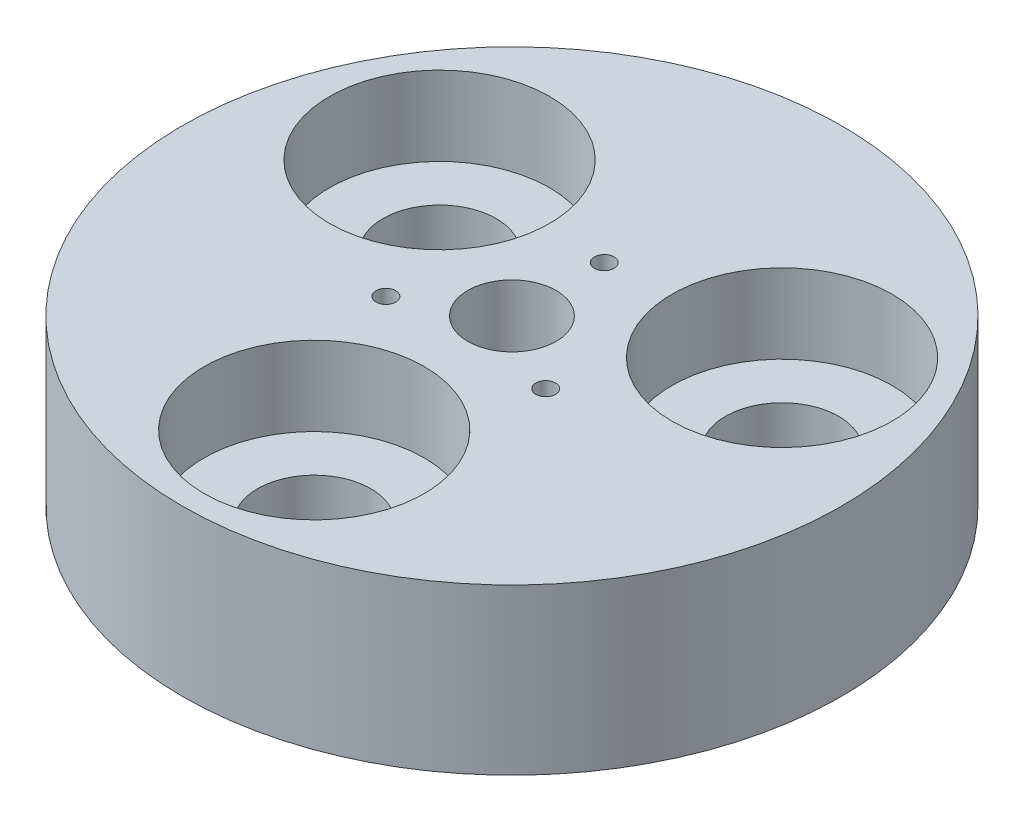
ISO-10303-21;
HEADER;
FILE_DESCRIPTION(('STEP AP214'),'2;1');
FILE_NAME('part.step','',(''),(''),'','','');
FILE_SCHEMA(('AUTOMOTIVE_DESIGN { 1 0 10303 214 1 1 1 1 }'));
ENDSEC;
DATA;
#1=APPLICATION_CONTEXT('core data for automotive mechanical design processes');
#2=APPLICATION_PROTOCOL_DEFINITION('international standard','automotive_design',2000,#1);
#3=PRODUCT_CONTEXT('',#1,'mechanical');
#4=PRODUCT('Part','Part','',(#3));
#5=PRODUCT_RELATED_PRODUCT_CATEGORY('part','',(#4));
#6=PRODUCT_DEFINITION_FORMATION('','',#4);
#7=PRODUCT_DEFINITION_CONTEXT('part definition',#1,'design');
#8=PRODUCT_DEFINITION('design','',#6,#7);
#9=PRODUCT_DEFINITION_SHAPE('','',#8);
#10=(LENGTH_UNIT() NAMED_UNIT(*) SI_UNIT(.MILLI.,.METRE.));
#11=(NAMED_UNIT(*) PLANE_ANGLE_UNIT() SI_UNIT($,.RADIAN.));
#12=(NAMED_UNIT(*) SI_UNIT($,.STERADIAN.) SOLID_ANGLE_UNIT());
#13=UNCERTAINTY_MEASURE_WITH_UNIT(LENGTH_MEASURE(1.E-05),#10,'distance_accuracy_value','');
#14=(GEOMETRIC_REPRESENTATION_CONTEXT(3) GLOBAL_UNCERTAINTY_ASSIGNED_CONTEXT((#13)) GLOBAL_UNIT_ASSIGNED_CONTEXT((#10,
#11,#12)) REPRESENTATION_CONTEXT('',''));
#15=CARTESIAN_POINT('',(0.,0.,0.));
#16=DIRECTION('',(0.,0.,1.));
#17=DIRECTION('',(1.,0.,0.));
#18=AXIS2_PLACEMENT_3D('',#15,#16,#17);
#19=CARTESIAN_POINT('',(0.,3.17500000000001,0.));
#20=DIRECTION('',(0.,-1.,0.));
#21=DIRECTION('',(0.,0.,-1.));
#22=AXIS2_PLACEMENT_3D('',#19,#20,#21);
#23=CYLINDRICAL_SURFACE('',#22,6.35);
#24=CARTESIAN_POINT('',(0.,3.17500000000001,0.));
#25=DIRECTION('',(0.,1.,0.));
#26=DIRECTION('',(0.,0.,1.));
#27=AXIS2_PLACEMENT_3D('',#24,#25,#26);
#28=CIRCLE('',#27,6.35);
#29=CARTESIAN_POINT('',(0.,3.17500000000001,6.35));
#30=VERTEX_POINT('',#29);
#31=EDGE_CURVE('E12',#30,#30,#28,.T.);
#32=ORIENTED_EDGE('',*,*,#31,.F.);
#33=EDGE_LOOP('',(#32));
#34=FACE_BOUND('',#33,.T.);
#35=CARTESIAN_POINT('',(0.,0.,0.));
#36=DIRECTION('',(0.,1.,0.));
#37=DIRECTION('',(0.,0.,1.));
#38=AXIS2_PLACEMENT_3D('',#35,#36,#37);
#39=CIRCLE('',#38,6.35);
#40=CARTESIAN_POINT('',(0.,0.,6.35));
#41=VERTEX_POINT('',#40);
#42=EDGE_CURVE('E48',#41,#41,#39,.T.);
#43=ORIENTED_EDGE('',*,*,#42,.T.);
#44=EDGE_LOOP('',(#43));
#45=FACE_BOUND('',#44,.T.);
#46=ADVANCED_FACE('F45',(#34,#45),#23,.T.);
#47=CARTESIAN_POINT('',(0.,3.17500000000001,0.));
#48=DIRECTION('',(0.,1.,0.));
#49=DIRECTION('',(0.,0.,1.));
#50=AXIS2_PLACEMENT_3D('',#47,#48,#49);
#51=PLANE('',#50);
#52=CARTESIAN_POINT('',(3.29955678841873,3.17500000000001,-1.90499999999997));
#53=DIRECTION('',(0.,1.,0.));
#54=DIRECTION('',(0.,0.,1.));
#55=AXIS2_PLACEMENT_3D('',#52,#53,#54);
#56=CIRCLE('',#55,2.12089999999999);
#57=CARTESIAN_POINT('',(3.29955678841873,3.17500000000001,0.215900000000025));
#58=VERTEX_POINT('',#57);
#59=EDGE_CURVE('E113',#58,#58,#56,.T.);
#60=ORIENTED_EDGE('',*,*,#59,.F.);
#61=EDGE_LOOP('',(#60));
#62=FACE_BOUND('',#61,.T.);
#63=CARTESIAN_POINT('',(-3.2995567884187,3.17500000000001,-1.90500000000002));
#64=DIRECTION('',(0.,1.,0.));
#65=DIRECTION('',(0.,0.,1.));
#66=AXIS2_PLACEMENT_3D('',#63,#64,#65);
#67=CIRCLE('',#66,2.12089999999999);
#68=CARTESIAN_POINT('',(-3.2995567884187,3.17500000000001,0.21589999999998));
#69=VERTEX_POINT('',#68);
#70=EDGE_CURVE('E101',#69,#69,#67,.T.);
#71=ORIENTED_EDGE('',*,*,#70,.F.);
#72=EDGE_LOOP('',(#71));
#73=FACE_BOUND('',#72,.T.);
#74=CARTESIAN_POINT('',(0.,3.17500000000001,3.81));
#75=DIRECTION('',(0.,1.,0.));
#76=DIRECTION('',(0.,0.,1.));
#77=AXIS2_PLACEMENT_3D('',#74,#75,#76);
#78=CIRCLE('',#77,2.12089999999999);
#79=CARTESIAN_POINT('',(0.,3.17500000000001,5.9309));
#80=VERTEX_POINT('',#79);
#81=EDGE_CURVE('E89',#80,#80,#78,.T.);
#82=ORIENTED_EDGE('',*,*,#81,.F.);
#83=EDGE_LOOP('',(#82));
#84=FACE_BOUND('',#83,.T.);
#85=CARTESIAN_POINT('',(0.,3.17500000000001,0.));
#86=DIRECTION('',(0.,1.,0.));
#87=DIRECTION('',(0.,0.,1.));
#88=AXIS2_PLACEMENT_3D('',#85,#86,#87);
#89=CIRCLE('',#88,0.8509);
#90=CARTESIAN_POINT('',(0.,3.17500000000001,0.8509));
#91=VERTEX_POINT('',#90);
#92=EDGE_CURVE('E77',#91,#91,#89,.T.);
#93=ORIENTED_EDGE('',*,*,#92,.F.);
#94=EDGE_LOOP('',(#93));
#95=FACE_BOUND('',#94,.T.);
#96=CARTESIAN_POINT('',(1.53979316792873,3.17500000000001,0.889000000000008));
#97=DIRECTION('',(0.,1.,0.));
#98=DIRECTION('',(-0.866025403784437,0.,-0.500000000000004));
#99=AXIS2_PLACEMENT_3D('',#96,#97,#98);
#100=CIRCLE('',#99,0.1905);
#101=CARTESIAN_POINT('',(1.37481532850779,3.17500000000001,0.793750000000008));
#102=VERTEX_POINT('',#101);
#103=EDGE_CURVE('E70',#102,#102,#100,.T.);
#104=ORIENTED_EDGE('',*,*,#103,.F.);
#105=EDGE_LOOP('',(#104));
#106=FACE_BOUND('',#105,.T.);
#107=CARTESIAN_POINT('',(-1.53979316792874,3.17500000000001,0.888999999999987));
#108=DIRECTION('',(0.,1.,0.));
#109=DIRECTION('',(0.866025403784444,0.,-0.499999999999992));
#110=AXIS2_PLACEMENT_3D('',#107,#108,#109);
#111=CIRCLE('',#110,0.1905);
#112=CARTESIAN_POINT('',(-1.37481532850781,3.17500000000001,0.793749999999988));
#113=VERTEX_POINT('',#112);
#114=EDGE_CURVE('E63',#113,#113,#111,.T.);
#115=ORIENTED_EDGE('',*,*,#114,.F.);
#116=EDGE_LOOP('',(#115));
#117=FACE_BOUND('',#116,.T.);
#118=CARTESIAN_POINT('',(0.,3.17500000000001,-1.778));
#119=DIRECTION('',(0.,1.,0.));
#120=DIRECTION('',(0.,0.,1.));
#121=AXIS2_PLACEMENT_3D('',#118,#119,#120);
#122=CIRCLE('',#121,0.1905);
#123=CARTESIAN_POINT('',(0.,3.17500000000001,-1.5875));
#124=VERTEX_POINT('',#123);
#125=EDGE_CURVE('E57',#124,#124,#122,.T.);
#126=ORIENTED_EDGE('',*,*,#125,.F.);
#127=EDGE_LOOP('',(#126));
#128=FACE_BOUND('',#127,.T.);
#129=ORIENTED_EDGE('',*,*,#31,.T.);
#130=EDGE_LOOP('',(#129));
#131=FACE_BOUND('',#130,.T.);
#132=ADVANCED_FACE('F119',(#62,#73,#84,#95,#106,#117,#128,#131),#51,.T.);
#133=CARTESIAN_POINT('',(0.,0.,0.));
#134=DIRECTION('',(0.,1.,0.));
#135=DIRECTION('',(0.,0.,1.));
#136=AXIS2_PLACEMENT_3D('',#133,#134,#135);
#137=PLANE('',#136);
#138=CARTESIAN_POINT('',(3.29955678841873,0.,-1.90499999999997));
#139=DIRECTION('',(0.,1.,0.));
#140=DIRECTION('',(0.,0.,1.));
#141=AXIS2_PLACEMENT_3D('',#138,#139,#140);
#142=CIRCLE('',#141,1.0922);
#143=CARTESIAN_POINT('',(3.29955678841873,0.,-0.81279999999997));
#144=VERTEX_POINT('',#143);
#145=EDGE_CURVE('E104',#144,#144,#142,.T.);
#146=ORIENTED_EDGE('',*,*,#145,.T.);
#147=EDGE_LOOP('',(#146));
#148=FACE_BOUND('',#147,.T.);
#149=CARTESIAN_POINT('',(-3.2995567884187,0.,-1.90500000000002));
#150=DIRECTION('',(0.,1.,0.));
#151=DIRECTION('',(0.,0.,1.));
#152=AXIS2_PLACEMENT_3D('',#149,#150,#151);
#153=CIRCLE('',#152,1.0922);
#154=CARTESIAN_POINT('',(-3.2995567884187,0.,-0.812800000000017));
#155=VERTEX_POINT('',#154);
#156=EDGE_CURVE('E92',#155,#155,#153,.T.);
#157=ORIENTED_EDGE('',*,*,#156,.T.);
#158=EDGE_LOOP('',(#157));
#159=FACE_BOUND('',#158,.T.);
#160=CARTESIAN_POINT('',(0.,0.,3.81));
#161=DIRECTION('',(0.,1.,0.));
#162=DIRECTION('',(0.,0.,1.));
#163=AXIS2_PLACEMENT_3D('',#160,#161,#162);
#164=CIRCLE('',#163,1.0922);
#165=CARTESIAN_POINT('',(0.,0.,4.9022));
#166=VERTEX_POINT('',#165);
#167=EDGE_CURVE('E80',#166,#166,#164,.T.);
#168=ORIENTED_EDGE('',*,*,#167,.T.);
#169=EDGE_LOOP('',(#168));
#170=FACE_BOUND('',#169,.T.);
#171=CARTESIAN_POINT('',(0.,0.,0.));
#172=DIRECTION('',(0.,1.,0.));
#173=DIRECTION('',(0.,0.,1.));
#174=AXIS2_PLACEMENT_3D('',#171,#172,#173);
#175=CIRCLE('',#174,0.8509);
#176=CARTESIAN_POINT('',(0.,0.,0.8509));
#177=VERTEX_POINT('',#176);
#178=EDGE_CURVE('E67',#177,#177,#175,.F.);
#179=ORIENTED_EDGE('',*,*,#178,.F.);
#180=EDGE_LOOP('',(#179));
#181=FACE_BOUND('',#180,.T.);
#182=ORIENTED_EDGE('',*,*,#42,.F.);
#183=EDGE_LOOP('',(#182));
#184=FACE_BOUND('',#183,.T.);
#185=ADVANCED_FACE('F122',(#148,#159,#170,#181,#184),#137,.F.);
#186=CARTESIAN_POINT('',(0.,1.26999999999999,-1.778));
#187=DIRECTION('',(0.,1.,0.));
#188=DIRECTION('',(0.,0.,1.));
#189=AXIS2_PLACEMENT_3D('',#186,#187,#188);
#190=CYLINDRICAL_SURFACE('',#189,0.1905);
#191=CARTESIAN_POINT('',(0.,1.26999999999999,-1.778));
#192=DIRECTION('',(0.,1.,0.));
#193=DIRECTION('',(0.,0.,1.));
#194=AXIS2_PLACEMENT_3D('',#191,#192,#193);
#195=CIRCLE('',#194,0.1905);
#196=CARTESIAN_POINT('',(0.,1.26999999999999,-1.5875));
#197=VERTEX_POINT('',#196);
#198=EDGE_CURVE('E55',#197,#197,#195,.T.);
#199=ORIENTED_EDGE('',*,*,#198,.F.);
#200=EDGE_LOOP('',(#199));
#201=FACE_BOUND('',#200,.T.);
#202=ORIENTED_EDGE('',*,*,#125,.T.);
#203=EDGE_LOOP('',(#202));
#204=FACE_BOUND('',#203,.T.);
#205=ADVANCED_FACE('F136',(#201,#204),#190,.F.);
#206=CARTESIAN_POINT('',(0.,1.26999999999999,-1.778));
#207=DIRECTION('',(0.,1.,0.));
#208=DIRECTION('',(0.,0.,1.));
#209=AXIS2_PLACEMENT_3D('',#206,#207,#208);
#210=PLANE('',#209);
#211=ORIENTED_EDGE('',*,*,#198,.T.);
#212=EDGE_LOOP('',(#211));
#213=FACE_BOUND('',#212,.T.);
#214=ADVANCED_FACE('F138',(#213),#210,.T.);
#215=CARTESIAN_POINT('',(-1.53979316792874,1.26999999999999,0.888999999999987));
#216=DIRECTION('',(0.,1.,0.));
#217=DIRECTION('',(0.,0.,1.));
#218=AXIS2_PLACEMENT_3D('',#215,#216,#217);
#219=CYLINDRICAL_SURFACE('',#218,0.1905);
#220=CARTESIAN_POINT('',(-1.53979316792874,1.26999999999999,0.888999999999987));
#221=DIRECTION('',(0.,1.,0.));
#222=DIRECTION('',(0.866025403784444,0.,-0.499999999999992));
#223=AXIS2_PLACEMENT_3D('',#220,#221,#222);
#224=CIRCLE('',#223,0.1905);
#225=CARTESIAN_POINT('',(-1.37481532850781,1.26999999999999,0.793749999999988));
#226=VERTEX_POINT('',#225);
#227=EDGE_CURVE('E66',#226,#226,#224,.T.);
#228=ORIENTED_EDGE('',*,*,#227,.F.);
#229=EDGE_LOOP('',(#228));
#230=FACE_BOUND('',#229,.T.);
#231=ORIENTED_EDGE('',*,*,#114,.T.);
#232=EDGE_LOOP('',(#231));
#233=FACE_BOUND('',#232,.T.);
#234=ADVANCED_FACE('F145',(#230,#233),#219,.F.);
#235=CARTESIAN_POINT('',(-1.53979316792874,1.26999999999999,0.888999999999987));
#236=DIRECTION('',(0.,1.,0.));
#237=DIRECTION('',(0.866025403784444,0.,-0.499999999999992));
#238=AXIS2_PLACEMENT_3D('',#235,#236,#237);
#239=PLANE('',#238);
#240=ORIENTED_EDGE('',*,*,#227,.T.);
#241=EDGE_LOOP('',(#240));
#242=FACE_BOUND('',#241,.T.);
#243=ADVANCED_FACE('F178',(#242),#239,.T.);
#244=CARTESIAN_POINT('',(1.53979316792873,1.26999999999999,0.889000000000008));
#245=DIRECTION('',(0.,1.,0.));
#246=DIRECTION('',(0.,0.,1.));
#247=AXIS2_PLACEMENT_3D('',#244,#245,#246);
#248=CYLINDRICAL_SURFACE('',#247,0.1905);
#249=CARTESIAN_POINT('',(1.53979316792873,1.26999999999999,0.889000000000008));
#250=DIRECTION('',(0.,1.,0.));
#251=DIRECTION('',(-0.866025403784437,0.,-0.500000000000004));
#252=AXIS2_PLACEMENT_3D('',#249,#250,#251);
#253=CIRCLE('',#252,0.1905);
#254=CARTESIAN_POINT('',(1.37481532850779,1.26999999999999,0.793750000000007));
#255=VERTEX_POINT('',#254);
#256=EDGE_CURVE('E60',#255,#255,#253,.T.);
#257=ORIENTED_EDGE('',*,*,#256,.F.);
#258=EDGE_LOOP('',(#257));
#259=FACE_BOUND('',#258,.T.);
#260=ORIENTED_EDGE('',*,*,#103,.T.);
#261=EDGE_LOOP('',(#260));
#262=FACE_BOUND('',#261,.T.);
#263=ADVANCED_FACE('F186',(#259,#262),#248,.F.);
#264=CARTESIAN_POINT('',(1.53979316792873,1.26999999999999,0.889000000000008));
#265=DIRECTION('',(0.,1.,0.));
#266=DIRECTION('',(-0.866025403784437,0.,-0.500000000000004));
#267=AXIS2_PLACEMENT_3D('',#264,#265,#266);
#268=PLANE('',#267);
#269=ORIENTED_EDGE('',*,*,#256,.T.);
#270=EDGE_LOOP('',(#269));
#271=FACE_BOUND('',#270,.T.);
#272=ADVANCED_FACE('F194',(#271),#268,.T.);
#273=CARTESIAN_POINT('',(0.,-2.40670864044654,0.));
#274=DIRECTION('',(0.,1.,0.));
#275=DIRECTION('',(0.,0.,1.));
#276=AXIS2_PLACEMENT_3D('',#273,#274,#275);
#277=CYLINDRICAL_SURFACE('',#276,0.8509);
#278=ORIENTED_EDGE('',*,*,#178,.T.);
#279=EDGE_LOOP('',(#278));
#280=FACE_BOUND('',#279,.T.);
#281=ORIENTED_EDGE('',*,*,#92,.T.);
#282=EDGE_LOOP('',(#281));
#283=FACE_BOUND('',#282,.T.);
#284=ADVANCED_FACE('F202',(#280,#283),#277,.F.);
#285=CARTESIAN_POINT('',(0.,3.17500000000001,3.81));
#286=DIRECTION('',(0.,1.,0.));
#287=DIRECTION('',(0.,0.,1.));
#288=AXIS2_PLACEMENT_3D('',#285,#286,#287);
#289=CYLINDRICAL_SURFACE('',#288,1.0922);
#290=ORIENTED_EDGE('',*,*,#167,.F.);
#291=EDGE_LOOP('',(#290));
#292=FACE_BOUND('',#291,.T.);
#293=CARTESIAN_POINT('',(0.,1.65099999999999,3.81));
#294=DIRECTION('',(0.,1.,0.));
#295=DIRECTION('',(0.,0.,1.));
#296=AXIS2_PLACEMENT_3D('',#293,#294,#295);
#297=CIRCLE('',#296,1.0922);
#298=CARTESIAN_POINT('',(0.,1.65099999999999,4.9022));
#299=VERTEX_POINT('',#298);
#300=EDGE_CURVE('E83',#299,#299,#297,.T.);
#301=ORIENTED_EDGE('',*,*,#300,.T.);
#302=EDGE_LOOP('',(#301));
#303=FACE_BOUND('',#302,.T.);
#304=ADVANCED_FACE('F210',(#292,#303),#289,.F.);
#305=CARTESIAN_POINT('',(1.0922,1.65099999999999,3.81));
#306=DIRECTION('',(0.,-1.,0.));
#307=DIRECTION('',(0.,0.,-1.));
#308=AXIS2_PLACEMENT_3D('',#305,#306,#307);
#309=PLANE('',#308);
#310=ORIENTED_EDGE('',*,*,#300,.F.);
#311=EDGE_LOOP('',(#310));
#312=FACE_BOUND('',#311,.T.);
#313=CARTESIAN_POINT('',(0.,1.65099999999999,3.81));
#314=DIRECTION('',(0.,1.,0.));
#315=DIRECTION('',(0.,0.,1.));
#316=AXIS2_PLACEMENT_3D('',#313,#314,#315);
#317=CIRCLE('',#316,2.1209);
#318=CARTESIAN_POINT('',(0.,1.65099999999999,5.9309));
#319=VERTEX_POINT('',#318);
#320=EDGE_CURVE('E86',#319,#319,#317,.T.);
#321=ORIENTED_EDGE('',*,*,#320,.T.);
#322=EDGE_LOOP('',(#321));
#323=FACE_BOUND('',#322,.T.);
#324=ADVANCED_FACE('F218',(#312,#323),#309,.F.);
#325=CARTESIAN_POINT('',(0.,3.17500000000001,3.81));
#326=DIRECTION('',(0.,1.,0.));
#327=DIRECTION('',(0.,0.,1.));
#328=AXIS2_PLACEMENT_3D('',#325,#326,#327);
#329=CYLINDRICAL_SURFACE('',#328,2.1209);
#330=ORIENTED_EDGE('',*,*,#320,.F.);
#331=EDGE_LOOP('',(#330));
#332=FACE_BOUND('',#331,.T.);
#333=ORIENTED_EDGE('',*,*,#81,.T.);
#334=EDGE_LOOP('',(#333));
#335=FACE_BOUND('',#334,.T.);
#336=ADVANCED_FACE('F226',(#332,#335),#329,.F.);
#337=CARTESIAN_POINT('',(-3.2995567884187,3.17500000000001,-1.90500000000002));
#338=DIRECTION('',(0.,1.,0.));
#339=DIRECTION('',(0.,0.,1.));
#340=AXIS2_PLACEMENT_3D('',#337,#338,#339);
#341=CYLINDRICAL_SURFACE('',#340,1.0922);
#342=ORIENTED_EDGE('',*,*,#156,.F.);
#343=EDGE_LOOP('',(#342));
#344=FACE_BOUND('',#343,.T.);
#345=CARTESIAN_POINT('',(-3.2995567884187,1.65099999999999,-1.90500000000002));
#346=DIRECTION('',(0.,1.,0.));
#347=DIRECTION('',(0.,0.,1.));
#348=AXIS2_PLACEMENT_3D('',#345,#346,#347);
#349=CIRCLE('',#348,1.0922);
#350=CARTESIAN_POINT('',(-3.2995567884187,1.65099999999999,-0.812800000000016));
#351=VERTEX_POINT('',#350);
#352=EDGE_CURVE('E95',#351,#351,#349,.T.);
#353=ORIENTED_EDGE('',*,*,#352,.T.);
#354=EDGE_LOOP('',(#353));
#355=FACE_BOUND('',#354,.T.);
#356=ADVANCED_FACE('F234',(#344,#355),#341,.F.);
#357=CARTESIAN_POINT('',(-2.2073567884187,1.65099999999999,-1.90500000000002));
#358=DIRECTION('',(0.,-1.,0.));
#359=DIRECTION('',(0.,0.,-1.));
#360=AXIS2_PLACEMENT_3D('',#357,#358,#359);
#361=PLANE('',#360);
#362=ORIENTED_EDGE('',*,*,#352,.F.);
#363=EDGE_LOOP('',(#362));
#364=FACE_BOUND('',#363,.T.);
#365=CARTESIAN_POINT('',(-3.2995567884187,1.65099999999999,-1.90500000000002));
#366=DIRECTION('',(0.,1.,0.));
#367=DIRECTION('',(0.,0.,1.));
#368=AXIS2_PLACEMENT_3D('',#365,#366,#367);
#369=CIRCLE('',#368,2.1209);
#370=CARTESIAN_POINT('',(-3.2995567884187,1.65099999999999,0.21589999999998));
#371=VERTEX_POINT('',#370);
#372=EDGE_CURVE('E98',#371,#371,#369,.T.);
#373=ORIENTED_EDGE('',*,*,#372,.T.);
#374=EDGE_LOOP('',(#373));
#375=FACE_BOUND('',#374,.T.);
#376=ADVANCED_FACE('F242',(#364,#375),#361,.F.);
#377=CARTESIAN_POINT('',(-3.2995567884187,3.17500000000001,-1.90500000000002));
#378=DIRECTION('',(0.,1.,0.));
#379=DIRECTION('',(0.,0.,1.));
#380=AXIS2_PLACEMENT_3D('',#377,#378,#379);
#381=CYLINDRICAL_SURFACE('',#380,2.1209);
#382=ORIENTED_EDGE('',*,*,#372,.F.);
#383=EDGE_LOOP('',(#382));
#384=FACE_BOUND('',#383,.T.);
#385=ORIENTED_EDGE('',*,*,#70,.T.);
#386=EDGE_LOOP('',(#385));
#387=FACE_BOUND('',#386,.T.);
#388=ADVANCED_FACE('F250',(#384,#387),#381,.F.);
#389=CARTESIAN_POINT('',(3.29955678841873,3.17500000000001,-1.90499999999997));
#390=DIRECTION('',(0.,1.,0.));
#391=DIRECTION('',(0.,0.,1.));
#392=AXIS2_PLACEMENT_3D('',#389,#390,#391);
#393=CYLINDRICAL_SURFACE('',#392,1.0922);
#394=ORIENTED_EDGE('',*,*,#145,.F.);
#395=EDGE_LOOP('',(#394));
#396=FACE_BOUND('',#395,.T.);
#397=CARTESIAN_POINT('',(3.29955678841873,1.65099999999999,-1.90499999999997));
#398=DIRECTION('',(0.,1.,0.));
#399=DIRECTION('',(0.,0.,1.));
#400=AXIS2_PLACEMENT_3D('',#397,#398,#399);
#401=CIRCLE('',#400,1.0922);
#402=CARTESIAN_POINT('',(3.29955678841873,1.65099999999999,-0.81279999999997));
#403=VERTEX_POINT('',#402);
#404=EDGE_CURVE('E107',#403,#403,#401,.T.);
#405=ORIENTED_EDGE('',*,*,#404,.T.);
#406=EDGE_LOOP('',(#405));
#407=FACE_BOUND('',#406,.T.);
#408=ADVANCED_FACE('F258',(#396,#407),#393,.F.);
#409=CARTESIAN_POINT('',(4.39175678841873,1.65099999999999,-1.90499999999997));
#410=DIRECTION('',(0.,-1.,0.));
#411=DIRECTION('',(0.,0.,-1.));
#412=AXIS2_PLACEMENT_3D('',#409,#410,#411);
#413=PLANE('',#412);
#414=ORIENTED_EDGE('',*,*,#404,.F.);
#415=EDGE_LOOP('',(#414));
#416=FACE_BOUND('',#415,.T.);
#417=CARTESIAN_POINT('',(3.29955678841873,1.65099999999999,-1.90499999999997));
#418=DIRECTION('',(0.,1.,0.));
#419=DIRECTION('',(0.,0.,1.));
#420=AXIS2_PLACEMENT_3D('',#417,#418,#419);
#421=CIRCLE('',#420,2.1209);
#422=CARTESIAN_POINT('',(3.29955678841873,1.65099999999999,0.215900000000027));
#423=VERTEX_POINT('',#422);
#424=EDGE_CURVE('E110',#423,#423,#421,.T.);
#425=ORIENTED_EDGE('',*,*,#424,.T.);
#426=EDGE_LOOP('',(#425));
#427=FACE_BOUND('',#426,.T.);
#428=ADVANCED_FACE('F266',(#416,#427),#413,.F.);
#429=CARTESIAN_POINT('',(3.29955678841873,3.17500000000001,-1.90499999999997));
#430=DIRECTION('',(0.,1.,0.));
#431=DIRECTION('',(0.,0.,1.));
#432=AXIS2_PLACEMENT_3D('',#429,#430,#431);
#433=CYLINDRICAL_SURFACE('',#432,2.1209);
#434=ORIENTED_EDGE('',*,*,#424,.F.);
#435=EDGE_LOOP('',(#434));
#436=FACE_BOUND('',#435,.T.);
#437=ORIENTED_EDGE('',*,*,#59,.T.);
#438=EDGE_LOOP('',(#437));
#439=FACE_BOUND('',#438,.T.);
#440=ADVANCED_FACE('F117',(#436,#439),#433,.F.);
#441=CLOSED_SHELL('',(#46,#132,#185,#205,#214,#234,#243,#263,#272,#284,#304,#324,#336,#356,#376,
#388,#408,#428,#440));
#442=MANIFOLD_SOLID_BREP('B2',#441);
#443=ADVANCED_BREP_SHAPE_REPRESENTATION('',(#18,#442),#14);
#444=SHAPE_DEFINITION_REPRESENTATION(#9,#443);
ENDSEC;
END-ISO-10303-21;
